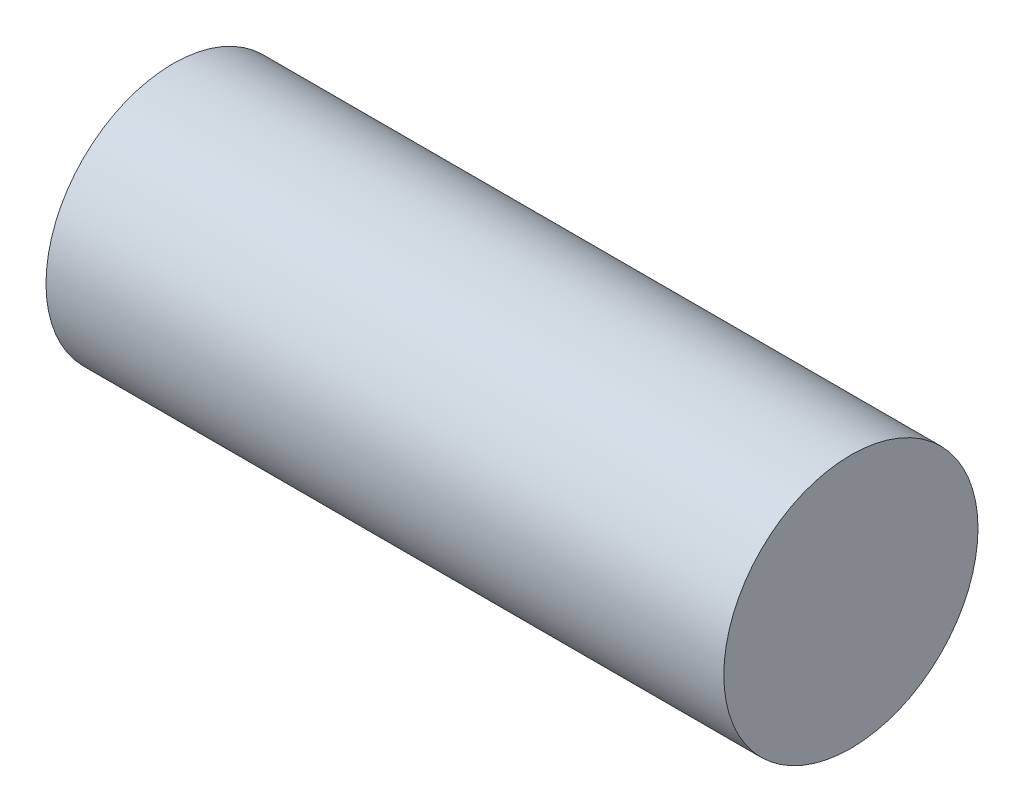
ISO-10303-21;
HEADER;
FILE_DESCRIPTION(('STEP AP214'),'2;1');
FILE_NAME('part.step','',(''),(''),'','','');
FILE_SCHEMA(('AUTOMOTIVE_DESIGN { 1 0 10303 214 1 1 1 1 }'));
ENDSEC;
DATA;
#1=APPLICATION_CONTEXT('core data for automotive mechanical design processes');
#2=APPLICATION_PROTOCOL_DEFINITION('international standard','automotive_design',2000,#1);
#3=PRODUCT_CONTEXT('',#1,'mechanical');
#4=PRODUCT('Part','Part','',(#3));
#5=PRODUCT_RELATED_PRODUCT_CATEGORY('part','',(#4));
#6=PRODUCT_DEFINITION_FORMATION('','',#4);
#7=PRODUCT_DEFINITION_CONTEXT('part definition',#1,'design');
#8=PRODUCT_DEFINITION('design','',#6,#7);
#9=PRODUCT_DEFINITION_SHAPE('','',#8);
#10=(LENGTH_UNIT() NAMED_UNIT(*) SI_UNIT(.MILLI.,.METRE.));
#11=(NAMED_UNIT(*) PLANE_ANGLE_UNIT() SI_UNIT($,.RADIAN.));
#12=(NAMED_UNIT(*) SI_UNIT($,.STERADIAN.) SOLID_ANGLE_UNIT());
#13=UNCERTAINTY_MEASURE_WITH_UNIT(LENGTH_MEASURE(1.E-05),#10,'distance_accuracy_value','');
#14=(GEOMETRIC_REPRESENTATION_CONTEXT(3) GLOBAL_UNCERTAINTY_ASSIGNED_CONTEXT((#13)) GLOBAL_UNIT_ASSIGNED_CONTEXT((#10,
#11,#12)) REPRESENTATION_CONTEXT('',''));
#15=CARTESIAN_POINT('',(0.,0.,0.));
#16=DIRECTION('',(0.,0.,1.));
#17=DIRECTION('',(1.,0.,0.));
#18=AXIS2_PLACEMENT_3D('',#15,#16,#17);
#19=CARTESIAN_POINT('',(101.6,0.,0.));
#20=DIRECTION('',(-1.,0.,0.));
#21=DIRECTION('',(0.,0.,1.));
#22=AXIS2_PLACEMENT_3D('',#19,#20,#21);
#23=CYLINDRICAL_SURFACE('',#22,38.1);
#24=CARTESIAN_POINT('',(101.6,0.,0.));
#25=DIRECTION('',(1.,0.,0.));
#26=DIRECTION('',(0.,0.,-1.));
#27=AXIS2_PLACEMENT_3D('',#24,#25,#26);
#28=CIRCLE('',#27,38.1);
#29=CARTESIAN_POINT('',(101.6,0.,-38.1));
#30=VERTEX_POINT('',#29);
#31=EDGE_CURVE('E10',#30,#30,#28,.T.);
#32=ORIENTED_EDGE('',*,*,#31,.F.);
#33=EDGE_LOOP('',(#32));
#34=FACE_BOUND('',#33,.T.);
#35=CARTESIAN_POINT('',(-101.6,0.,0.));
#36=DIRECTION('',(1.,0.,0.));
#37=DIRECTION('',(0.,0.,-1.));
#38=AXIS2_PLACEMENT_3D('',#35,#36,#37);
#39=CIRCLE('',#38,38.1);
#40=CARTESIAN_POINT('',(-101.6,0.,-38.1));
#41=VERTEX_POINT('',#40);
#42=EDGE_CURVE('E36',#41,#41,#39,.T.);
#43=ORIENTED_EDGE('',*,*,#42,.T.);
#44=EDGE_LOOP('',(#43));
#45=FACE_BOUND('',#44,.T.);
#46=ADVANCED_FACE('F33',(#34,#45),#23,.T.);
#47=CARTESIAN_POINT('',(101.6,0.,0.));
#48=DIRECTION('',(1.,0.,0.));
#49=DIRECTION('',(0.,0.,-1.));
#50=AXIS2_PLACEMENT_3D('',#47,#48,#49);
#51=PLANE('',#50);
#52=ORIENTED_EDGE('',*,*,#31,.T.);
#53=EDGE_LOOP('',(#52));
#54=FACE_BOUND('',#53,.T.);
#55=ADVANCED_FACE('F48',(#54),#51,.T.);
#56=CARTESIAN_POINT('',(-101.6,0.,0.));
#57=DIRECTION('',(1.,0.,0.));
#58=DIRECTION('',(0.,0.,-1.));
#59=AXIS2_PLACEMENT_3D('',#56,#57,#58);
#60=PLANE('',#59);
#61=ORIENTED_EDGE('',*,*,#42,.F.);
#62=EDGE_LOOP('',(#61));
#63=FACE_BOUND('',#62,.T.);
#64=ADVANCED_FACE('F46',(#63),#60,.F.);
#65=CLOSED_SHELL('',(#46,#55,#64));
#66=MANIFOLD_SOLID_BREP('B2',#65);
#67=ADVANCED_BREP_SHAPE_REPRESENTATION('',(#18,#66),#14);
#68=SHAPE_DEFINITION_REPRESENTATION(#9,#67);
ENDSEC;
END-ISO-10303-21;
